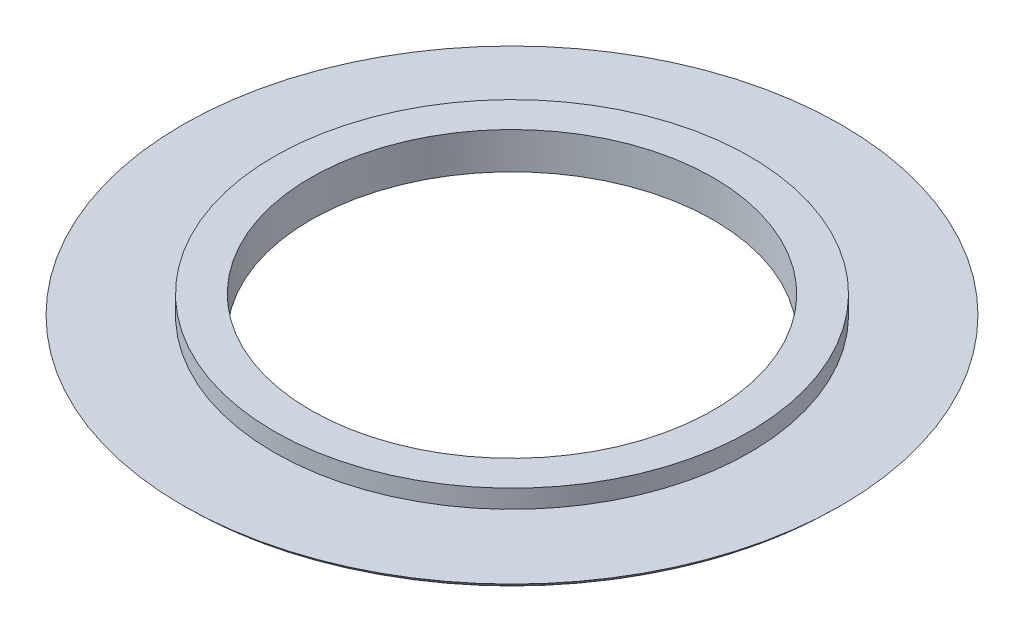
ISO-10303-21;
HEADER;
FILE_DESCRIPTION(('STEP AP214'),'2;1');
FILE_NAME('part.step','',(''),(''),'','','');
FILE_SCHEMA(('AUTOMOTIVE_DESIGN { 1 0 10303 214 1 1 1 1 }'));
ENDSEC;
DATA;
#1=APPLICATION_CONTEXT('core data for automotive mechanical design processes');
#2=APPLICATION_PROTOCOL_DEFINITION('international standard','automotive_design',2000,#1);
#3=PRODUCT_CONTEXT('',#1,'mechanical');
#4=PRODUCT('Part','Part','',(#3));
#5=PRODUCT_RELATED_PRODUCT_CATEGORY('part','',(#4));
#6=PRODUCT_DEFINITION_FORMATION('','',#4);
#7=PRODUCT_DEFINITION_CONTEXT('part definition',#1,'design');
#8=PRODUCT_DEFINITION('design','',#6,#7);
#9=PRODUCT_DEFINITION_SHAPE('','',#8);
#10=(LENGTH_UNIT() NAMED_UNIT(*) SI_UNIT(.MILLI.,.METRE.));
#11=(NAMED_UNIT(*) PLANE_ANGLE_UNIT() SI_UNIT($,.RADIAN.));
#12=(NAMED_UNIT(*) SI_UNIT($,.STERADIAN.) SOLID_ANGLE_UNIT());
#13=UNCERTAINTY_MEASURE_WITH_UNIT(LENGTH_MEASURE(1.E-05),#10,'distance_accuracy_value','');
#14=(GEOMETRIC_REPRESENTATION_CONTEXT(3) GLOBAL_UNCERTAINTY_ASSIGNED_CONTEXT((#13)) GLOBAL_UNIT_ASSIGNED_CONTEXT((#10,
#11,#12)) REPRESENTATION_CONTEXT('',''));
#15=CARTESIAN_POINT('',(0.,0.,0.));
#16=DIRECTION('',(0.,0.,1.));
#17=DIRECTION('',(1.,0.,0.));
#18=AXIS2_PLACEMENT_3D('',#15,#16,#17);
#19=CARTESIAN_POINT('',(0.,1.,0.));
#20=DIRECTION('',(0.,1.,0.));
#21=DIRECTION('',(0.,0.,1.));
#22=AXIS2_PLACEMENT_3D('',#19,#20,#21);
#23=PLANE('',#22);
#24=CARTESIAN_POINT('',(0.,1.,0.));
#25=DIRECTION('',(0.,1.,0.));
#26=DIRECTION('',(0.,0.,1.));
#27=AXIS2_PLACEMENT_3D('',#24,#25,#26);
#28=CIRCLE('',#27,13.);
#29=CARTESIAN_POINT('',(0.,1.,13.));
#30=VERTEX_POINT('',#29);
#31=EDGE_CURVE('E40',#30,#30,#28,.T.);
#32=ORIENTED_EDGE('',*,*,#31,.T.);
#33=EDGE_LOOP('',(#32));
#34=FACE_BOUND('',#33,.T.);
#35=CARTESIAN_POINT('',(0.,1.,0.));
#36=DIRECTION('',(0.,1.,0.));
#37=DIRECTION('',(0.,0.,1.));
#38=AXIS2_PLACEMENT_3D('',#35,#36,#37);
#39=CIRCLE('',#38,11.);
#40=CARTESIAN_POINT('',(0.,1.,11.));
#41=VERTEX_POINT('',#40);
#42=EDGE_CURVE('E44',#41,#41,#39,.T.);
#43=ORIENTED_EDGE('',*,*,#42,.F.);
#44=EDGE_LOOP('',(#43));
#45=FACE_BOUND('',#44,.T.);
#46=ADVANCED_FACE('F33',(#34,#45),#23,.T.);
#47=CARTESIAN_POINT('',(0.,1.,0.));
#48=DIRECTION('',(0.,-1.,0.));
#49=DIRECTION('',(0.,0.,-1.));
#50=AXIS2_PLACEMENT_3D('',#47,#48,#49);
#51=CYLINDRICAL_SURFACE('',#50,13.);
#52=ORIENTED_EDGE('',*,*,#31,.F.);
#53=EDGE_LOOP('',(#52));
#54=FACE_BOUND('',#53,.T.);
#55=CARTESIAN_POINT('',(0.,0.,0.));
#56=DIRECTION('',(0.,1.,0.));
#57=DIRECTION('',(0.,0.,1.));
#58=AXIS2_PLACEMENT_3D('',#55,#56,#57);
#59=CIRCLE('',#58,13.);
#60=CARTESIAN_POINT('',(0.,0.,13.));
#61=VERTEX_POINT('',#60);
#62=EDGE_CURVE('E49',#61,#61,#59,.T.);
#63=ORIENTED_EDGE('',*,*,#62,.T.);
#64=EDGE_LOOP('',(#63));
#65=FACE_BOUND('',#64,.T.);
#66=ADVANCED_FACE('F76',(#54,#65),#51,.T.);
#67=CARTESIAN_POINT('',(0.,1.,0.));
#68=DIRECTION('',(0.,-1.,0.));
#69=DIRECTION('',(0.,0.,-1.));
#70=AXIS2_PLACEMENT_3D('',#67,#68,#69);
#71=CYLINDRICAL_SURFACE('',#70,11.);
#72=ORIENTED_EDGE('',*,*,#42,.T.);
#73=EDGE_LOOP('',(#72));
#74=FACE_BOUND('',#73,.T.);
#75=CARTESIAN_POINT('',(0.,-1.,0.));
#76=DIRECTION('',(0.,-1.,0.));
#77=DIRECTION('',(0.,0.,-1.));
#78=AXIS2_PLACEMENT_3D('',#75,#76,#77);
#79=CIRCLE('',#78,11.);
#80=CARTESIAN_POINT('',(0.,-1.,-11.));
#81=VERTEX_POINT('',#80);
#82=EDGE_CURVE('E57',#81,#81,#79,.T.);
#83=ORIENTED_EDGE('',*,*,#82,.T.);
#84=EDGE_LOOP('',(#83));
#85=FACE_BOUND('',#84,.T.);
#86=ADVANCED_FACE('F64',(#74,#85),#71,.F.);
#87=CARTESIAN_POINT('',(0.,-1.,0.));
#88=DIRECTION('',(0.,-1.,0.));
#89=DIRECTION('',(0.,0.,-1.));
#90=AXIS2_PLACEMENT_3D('',#87,#88,#89);
#91=PLANE('',#90);
#92=CARTESIAN_POINT('',(0.,-1.,0.));
#93=DIRECTION('',(0.,-1.,0.));
#94=DIRECTION('',(0.,0.,-1.));
#95=AXIS2_PLACEMENT_3D('',#92,#93,#94);
#96=CIRCLE('',#95,15.7639320225002);
#97=CARTESIAN_POINT('',(0.,-1.,-15.7639320225002));
#98=VERTEX_POINT('',#97);
#99=EDGE_CURVE('E10',#98,#98,#96,.T.);
#100=ORIENTED_EDGE('',*,*,#99,.T.);
#101=EDGE_LOOP('',(#100));
#102=FACE_BOUND('',#101,.T.);
#103=ORIENTED_EDGE('',*,*,#82,.F.);
#104=EDGE_LOOP('',(#103));
#105=FACE_BOUND('',#104,.T.);
#106=ADVANCED_FACE('F66',(#102,#105),#91,.T.);
#107=CARTESIAN_POINT('',(0.,0.,0.));
#108=DIRECTION('',(0.,-1.,0.));
#109=DIRECTION('',(0.,0.,-1.));
#110=AXIS2_PLACEMENT_3D('',#107,#108,#109);
#111=PLANE('',#110);
#112=ORIENTED_EDGE('',*,*,#62,.F.);
#113=EDGE_LOOP('',(#112));
#114=FACE_BOUND('',#113,.T.);
#115=CARTESIAN_POINT('',(0.,0.,0.));
#116=DIRECTION('',(0.,-1.,0.));
#117=DIRECTION('',(0.,0.,-1.));
#118=AXIS2_PLACEMENT_3D('',#115,#116,#117);
#119=CIRCLE('',#118,18.);
#120=CARTESIAN_POINT('',(0.,0.,-18.));
#121=VERTEX_POINT('',#120);
#122=EDGE_CURVE('E53',#121,#121,#119,.T.);
#123=ORIENTED_EDGE('',*,*,#122,.F.);
#124=EDGE_LOOP('',(#123));
#125=FACE_BOUND('',#124,.T.);
#126=ADVANCED_FACE('F68',(#114,#125),#111,.F.);
#127=CARTESIAN_POINT('',(0.,2.,0.));
#128=DIRECTION('',(0.,1.,0.));
#129=DIRECTION('',(0.,0.,1.));
#130=AXIS2_PLACEMENT_3D('',#127,#128,#129);
#131=TOROIDAL_SURFACE('',#130,15.7639320225002,3.);
#132=ORIENTED_EDGE('',*,*,#122,.T.);
#133=EDGE_LOOP('',(#132));
#134=FACE_BOUND('',#133,.T.);
#135=ORIENTED_EDGE('',*,*,#99,.F.);
#136=EDGE_LOOP('',(#135));
#137=FACE_BOUND('',#136,.T.);
#138=ADVANCED_FACE('F35',(#134,#137),#131,.T.);
#139=CLOSED_SHELL('',(#46,#66,#86,#106,#126,#138));
#140=MANIFOLD_SOLID_BREP('B2',#139);
#141=ADVANCED_BREP_SHAPE_REPRESENTATION('',(#18,#140),#14);
#142=SHAPE_DEFINITION_REPRESENTATION(#9,#141);
ENDSEC;
END-ISO-10303-21;
